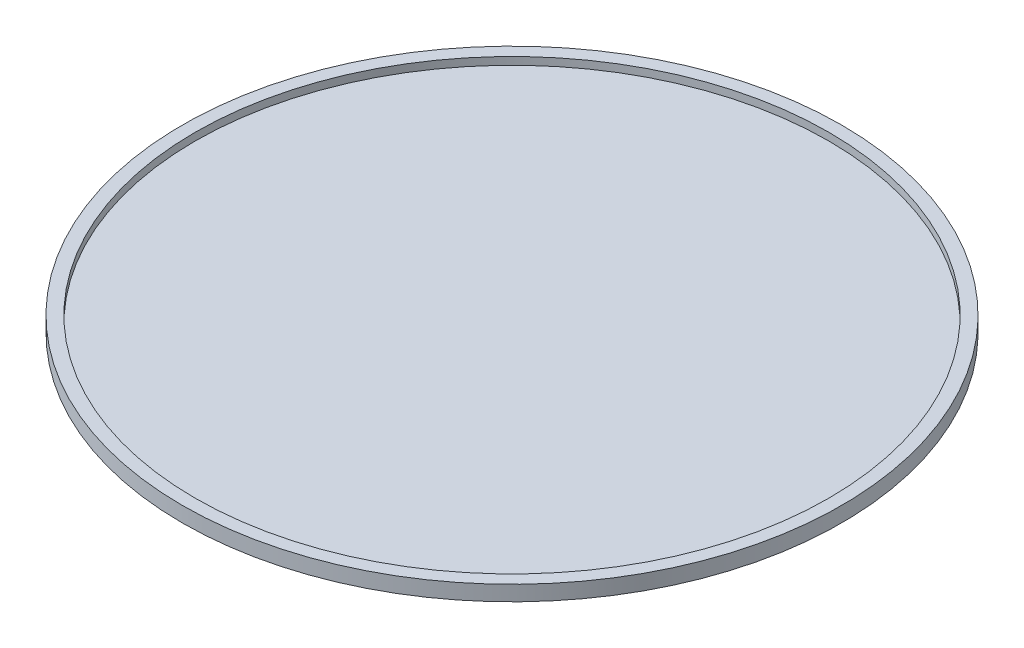
ISO-10303-21;
HEADER;
FILE_DESCRIPTION(('STEP AP214'),'2;1');
FILE_NAME('part.step','',(''),(''),'','','');
FILE_SCHEMA(('AUTOMOTIVE_DESIGN { 1 0 10303 214 1 1 1 1 }'));
ENDSEC;
DATA;
#1=APPLICATION_CONTEXT('core data for automotive mechanical design processes');
#2=APPLICATION_PROTOCOL_DEFINITION('international standard','automotive_design',2000,#1);
#3=PRODUCT_CONTEXT('',#1,'mechanical');
#4=PRODUCT('Part','Part','',(#3));
#5=PRODUCT_RELATED_PRODUCT_CATEGORY('part','',(#4));
#6=PRODUCT_DEFINITION_FORMATION('','',#4);
#7=PRODUCT_DEFINITION_CONTEXT('part definition',#1,'design');
#8=PRODUCT_DEFINITION('design','',#6,#7);
#9=PRODUCT_DEFINITION_SHAPE('','',#8);
#10=(LENGTH_UNIT() NAMED_UNIT(*) SI_UNIT(.MILLI.,.METRE.));
#11=(NAMED_UNIT(*) PLANE_ANGLE_UNIT() SI_UNIT($,.RADIAN.));
#12=(NAMED_UNIT(*) SI_UNIT($,.STERADIAN.) SOLID_ANGLE_UNIT());
#13=UNCERTAINTY_MEASURE_WITH_UNIT(LENGTH_MEASURE(1.E-05),#10,'distance_accuracy_value','');
#14=(GEOMETRIC_REPRESENTATION_CONTEXT(3) GLOBAL_UNCERTAINTY_ASSIGNED_CONTEXT((#13)) GLOBAL_UNIT_ASSIGNED_CONTEXT((#10,
#11,#12)) REPRESENTATION_CONTEXT('',''));
#15=CARTESIAN_POINT('',(0.,0.,0.));
#16=DIRECTION('',(0.,0.,1.));
#17=DIRECTION('',(1.,0.,0.));
#18=AXIS2_PLACEMENT_3D('',#15,#16,#17);
#19=CARTESIAN_POINT('',(0.,3.,0.));
#20=DIRECTION('',(0.,1.,0.));
#21=DIRECTION('',(0.,0.,1.));
#22=AXIS2_PLACEMENT_3D('',#19,#20,#21);
#23=PLANE('',#22);
#24=CARTESIAN_POINT('',(0.,3.,0.));
#25=DIRECTION('',(0.,1.,0.));
#26=DIRECTION('',(0.,0.,1.));
#27=AXIS2_PLACEMENT_3D('',#24,#25,#26);
#28=CIRCLE('',#27,125.);
#29=CARTESIAN_POINT('',(0.,3.,125.));
#30=VERTEX_POINT('',#29);
#31=EDGE_CURVE('E10',#30,#30,#28,.T.);
#32=ORIENTED_EDGE('',*,*,#31,.T.);
#33=EDGE_LOOP('',(#32));
#34=FACE_BOUND('',#33,.T.);
#35=ADVANCED_FACE('F30',(#34),#23,.T.);
#36=CARTESIAN_POINT('',(0.,-367.695526217005,0.));
#37=DIRECTION('',(0.,1.,0.));
#38=DIRECTION('',(0.,0.,1.));
#39=AXIS2_PLACEMENT_3D('',#36,#37,#38);
#40=CYLINDRICAL_SURFACE('',#39,130.);
#41=CARTESIAN_POINT('',(0.,0.,0.));
#42=DIRECTION('',(0.,1.,0.));
#43=DIRECTION('',(0.,0.,1.));
#44=AXIS2_PLACEMENT_3D('',#41,#42,#43);
#45=CIRCLE('',#44,130.);
#46=CARTESIAN_POINT('',(0.,0.,130.));
#47=VERTEX_POINT('',#46);
#48=EDGE_CURVE('E37',#47,#47,#45,.F.);
#49=ORIENTED_EDGE('',*,*,#48,.F.);
#50=EDGE_LOOP('',(#49));
#51=FACE_BOUND('',#50,.T.);
#52=CARTESIAN_POINT('',(0.,6.,0.));
#53=DIRECTION('',(0.,1.,0.));
#54=DIRECTION('',(0.,0.,1.));
#55=AXIS2_PLACEMENT_3D('',#52,#53,#54);
#56=CIRCLE('',#55,130.);
#57=CARTESIAN_POINT('',(0.,6.,130.));
#58=VERTEX_POINT('',#57);
#59=EDGE_CURVE('E41',#58,#58,#56,.T.);
#60=ORIENTED_EDGE('',*,*,#59,.F.);
#61=EDGE_LOOP('',(#60));
#62=FACE_BOUND('',#61,.T.);
#63=ADVANCED_FACE('F61',(#51,#62),#40,.T.);
#64=CARTESIAN_POINT('',(0.,-367.695526217005,0.));
#65=DIRECTION('',(0.,1.,0.));
#66=DIRECTION('',(0.,0.,1.));
#67=AXIS2_PLACEMENT_3D('',#64,#65,#66);
#68=CYLINDRICAL_SURFACE('',#67,125.);
#69=ORIENTED_EDGE('',*,*,#31,.F.);
#70=EDGE_LOOP('',(#69));
#71=FACE_BOUND('',#70,.T.);
#72=CARTESIAN_POINT('',(0.,6.,0.));
#73=DIRECTION('',(0.,1.,0.));
#74=DIRECTION('',(0.,0.,1.));
#75=AXIS2_PLACEMENT_3D('',#72,#73,#74);
#76=CIRCLE('',#75,125.);
#77=CARTESIAN_POINT('',(0.,6.,125.));
#78=VERTEX_POINT('',#77);
#79=EDGE_CURVE('E45',#78,#78,#76,.T.);
#80=ORIENTED_EDGE('',*,*,#79,.T.);
#81=EDGE_LOOP('',(#80));
#82=FACE_BOUND('',#81,.T.);
#83=ADVANCED_FACE('F51',(#71,#82),#68,.F.);
#84=CARTESIAN_POINT('',(0.,6.,0.));
#85=DIRECTION('',(0.,1.,0.));
#86=DIRECTION('',(0.,0.,1.));
#87=AXIS2_PLACEMENT_3D('',#84,#85,#86);
#88=PLANE('',#87);
#89=ORIENTED_EDGE('',*,*,#59,.T.);
#90=EDGE_LOOP('',(#89));
#91=FACE_BOUND('',#90,.T.);
#92=ORIENTED_EDGE('',*,*,#79,.F.);
#93=EDGE_LOOP('',(#92));
#94=FACE_BOUND('',#93,.T.);
#95=ADVANCED_FACE('F53',(#91,#94),#88,.T.);
#96=CARTESIAN_POINT('',(0.,0.,0.));
#97=DIRECTION('',(0.,1.,0.));
#98=DIRECTION('',(0.,0.,1.));
#99=AXIS2_PLACEMENT_3D('',#96,#97,#98);
#100=PLANE('',#99);
#101=ORIENTED_EDGE('',*,*,#48,.T.);
#102=EDGE_LOOP('',(#101));
#103=FACE_BOUND('',#102,.T.);
#104=ADVANCED_FACE('F32',(#103),#100,.F.);
#105=CLOSED_SHELL('',(#35,#63,#83,#95,#104));
#106=MANIFOLD_SOLID_BREP('B2',#105);
#107=ADVANCED_BREP_SHAPE_REPRESENTATION('',(#18,#106),#14);
#108=SHAPE_DEFINITION_REPRESENTATION(#9,#107);
ENDSEC;
END-ISO-10303-21;
